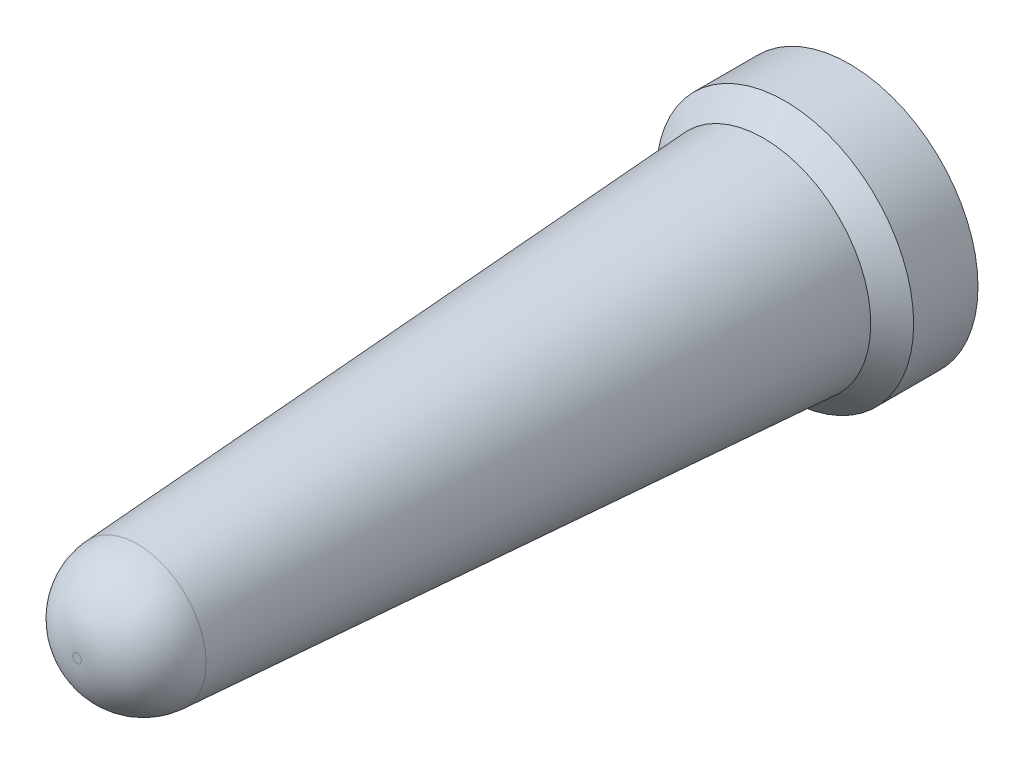
ISO-10303-21;
HEADER;
FILE_DESCRIPTION(('STEP AP214'),'2;1');
FILE_NAME('part.step','',(''),(''),'','','');
FILE_SCHEMA(('AUTOMOTIVE_DESIGN { 1 0 10303 214 1 1 1 1 }'));
ENDSEC;
DATA;
#1=APPLICATION_CONTEXT('core data for automotive mechanical design processes');
#2=APPLICATION_PROTOCOL_DEFINITION('international standard','automotive_design',2000,#1);
#3=PRODUCT_CONTEXT('',#1,'mechanical');
#4=PRODUCT('Part','Part','',(#3));
#5=PRODUCT_RELATED_PRODUCT_CATEGORY('part','',(#4));
#6=PRODUCT_DEFINITION_FORMATION('','',#4);
#7=PRODUCT_DEFINITION_CONTEXT('part definition',#1,'design');
#8=PRODUCT_DEFINITION('design','',#6,#7);
#9=PRODUCT_DEFINITION_SHAPE('','',#8);
#10=(LENGTH_UNIT() NAMED_UNIT(*) SI_UNIT(.MILLI.,.METRE.));
#11=(NAMED_UNIT(*) PLANE_ANGLE_UNIT() SI_UNIT($,.RADIAN.));
#12=(NAMED_UNIT(*) SI_UNIT($,.STERADIAN.) SOLID_ANGLE_UNIT());
#13=UNCERTAINTY_MEASURE_WITH_UNIT(LENGTH_MEASURE(1.E-05),#10,'distance_accuracy_value','');
#14=(GEOMETRIC_REPRESENTATION_CONTEXT(3) GLOBAL_UNCERTAINTY_ASSIGNED_CONTEXT((#13)) GLOBAL_UNIT_ASSIGNED_CONTEXT((#10,
#11,#12)) REPRESENTATION_CONTEXT('',''));
#15=CARTESIAN_POINT('',(0.,0.,0.));
#16=DIRECTION('',(0.,0.,1.));
#17=DIRECTION('',(1.,0.,0.));
#18=AXIS2_PLACEMENT_3D('',#15,#16,#17);
#19=CARTESIAN_POINT('',(0.,0.,2.286));
#20=DIRECTION('',(0.,0.,1.));
#21=DIRECTION('',(1.,0.,0.));
#22=AXIS2_PLACEMENT_3D('',#19,#20,#21);
#23=CYLINDRICAL_SURFACE('',#22,0.381);
#24=CARTESIAN_POINT('',(0.,0.,0.));
#25=DIRECTION('',(0.,0.,1.));
#26=DIRECTION('',(1.,0.,0.));
#27=AXIS2_PLACEMENT_3D('',#24,#25,#26);
#28=CIRCLE('',#27,0.381);
#29=CARTESIAN_POINT('',(0.381,0.,0.));
#30=VERTEX_POINT('',#29);
#31=EDGE_CURVE('E69',#30,#30,#28,.T.);
#32=ORIENTED_EDGE('',*,*,#31,.T.);
#33=EDGE_LOOP('',(#32));
#34=FACE_BOUND('',#33,.T.);
#35=CARTESIAN_POINT('',(0.,0.,0.190500000000001));
#36=DIRECTION('',(0.,0.,1.));
#37=DIRECTION('',(1.,0.,0.));
#38=AXIS2_PLACEMENT_3D('',#35,#36,#37);
#39=CIRCLE('',#38,0.381);
#40=CARTESIAN_POINT('',(0.381,0.,0.190500000000001));
#41=VERTEX_POINT('',#40);
#42=EDGE_CURVE('E11',#41,#41,#39,.T.);
#43=ORIENTED_EDGE('',*,*,#42,.F.);
#44=EDGE_LOOP('',(#43));
#45=FACE_BOUND('',#44,.T.);
#46=ADVANCED_FACE('F39',(#34,#45),#23,.T.);
#47=CARTESIAN_POINT('',(0.,0.,0.254));
#48=DIRECTION('',(0.,0.,-1.));
#49=DIRECTION('',(-1.,0.,0.));
#50=AXIS2_PLACEMENT_3D('',#47,#48,#49);
#51=CONICAL_SURFACE('',#50,0.317500000000008,0.785398163397396);
#52=ORIENTED_EDGE('',*,*,#42,.T.);
#53=EDGE_LOOP('',(#52));
#54=FACE_BOUND('',#53,.T.);
#55=CARTESIAN_POINT('',(0.,0.,0.254));
#56=DIRECTION('',(0.,0.,1.));
#57=DIRECTION('',(1.,0.,0.));
#58=AXIS2_PLACEMENT_3D('',#55,#56,#57);
#59=CIRCLE('',#58,0.317500000000008);
#60=CARTESIAN_POINT('',(0.317500000000008,0.,0.254));
#61=VERTEX_POINT('',#60);
#62=EDGE_CURVE('E46',#61,#61,#59,.T.);
#63=ORIENTED_EDGE('',*,*,#62,.F.);
#64=EDGE_LOOP('',(#63));
#65=FACE_BOUND('',#64,.T.);
#66=ADVANCED_FACE('F82',(#54,#65),#51,.T.);
#67=CARTESIAN_POINT('',(0.,0.,2.10722703261333));
#68=DIRECTION('',(0.,0.,-1.));
#69=DIRECTION('',(-1.,0.,0.));
#70=AXIS2_PLACEMENT_3D('',#67,#68,#69);
#71=CONICAL_SURFACE('',#70,0.203199999999999,0.0615981729434522);
#72=ORIENTED_EDGE('',*,*,#62,.T.);
#73=EDGE_LOOP('',(#72));
#74=FACE_BOUND('',#73,.T.);
#75=CARTESIAN_POINT('',(0.,0.,2.10722703261333));
#76=DIRECTION('',(0.,0.,1.));
#77=DIRECTION('',(1.,0.,0.));
#78=AXIS2_PLACEMENT_3D('',#75,#76,#77);
#79=CIRCLE('',#78,0.203199999999999);
#80=CARTESIAN_POINT('',(0.203199999999999,0.,2.10722703261333));
#81=VERTEX_POINT('',#80);
#82=EDGE_CURVE('E66',#81,#81,#79,.T.);
#83=ORIENTED_EDGE('',*,*,#82,.F.);
#84=EDGE_LOOP('',(#83));
#85=FACE_BOUND('',#84,.T.);
#86=ADVANCED_FACE('F79',(#74,#85),#71,.T.);
#87=CARTESIAN_POINT('',(0.,0.,2.0955));
#88=DIRECTION('',(0.,0.,1.));
#89=DIRECTION('',(1.,0.,0.));
#90=AXIS2_PLACEMENT_3D('',#87,#88,#89);
#91=DEGENERATE_TOROIDAL_SURFACE('',#90,0.013061296138619,0.190499999999999,.T.);
#92=ORIENTED_EDGE('',*,*,#82,.T.);
#93=EDGE_LOOP('',(#92));
#94=FACE_BOUND('',#93,.T.);
#95=CARTESIAN_POINT('',(0.,0.,2.286));
#96=DIRECTION('',(0.,0.,1.));
#97=DIRECTION('',(1.,0.,0.));
#98=AXIS2_PLACEMENT_3D('',#95,#96,#97);
#99=CIRCLE('',#98,0.013061296138619);
#100=CARTESIAN_POINT('',(0.013061296138619,0.,2.286));
#101=VERTEX_POINT('',#100);
#102=EDGE_CURVE('E60',#101,#101,#99,.T.);
#103=ORIENTED_EDGE('',*,*,#102,.F.);
#104=EDGE_LOOP('',(#103));
#105=FACE_BOUND('',#104,.T.);
#106=ADVANCED_FACE('F89',(#94,#105),#91,.T.);
#107=CARTESIAN_POINT('',(0.013061296138619,0.,2.286));
#108=DIRECTION('',(0.,0.,1.));
#109=DIRECTION('',(1.,0.,0.));
#110=AXIS2_PLACEMENT_3D('',#107,#108,#109);
#111=PLANE('',#110);
#112=ORIENTED_EDGE('',*,*,#102,.T.);
#113=EDGE_LOOP('',(#112));
#114=FACE_BOUND('',#113,.T.);
#115=ADVANCED_FACE('F53',(#114),#111,.T.);
#116=CARTESIAN_POINT('',(0.,0.,0.190500000000001));
#117=DIRECTION('',(0.,0.,-1.));
#118=DIRECTION('',(-1.,0.,0.));
#119=AXIS2_PLACEMENT_3D('',#116,#117,#118);
#120=CONICAL_SURFACE('',#119,0.2032,1.1042848218528);
#121=CARTESIAN_POINT('',(0.,0.,0.292828474698581));
#122=VERTEX_POINT('',#121);
#123=VERTEX_LOOP('',#122);
#124=FACE_BOUND('',#123,.T.);
#125=CARTESIAN_POINT('',(0.,0.,0.190500000000001));
#126=DIRECTION('',(0.,0.,1.));
#127=DIRECTION('',(1.,0.,0.));
#128=AXIS2_PLACEMENT_3D('',#125,#126,#127);
#129=CIRCLE('',#128,0.2032);
#130=CARTESIAN_POINT('',(0.2032,0.,0.190500000000001));
#131=VERTEX_POINT('',#130);
#132=EDGE_CURVE('E57',#131,#131,#129,.T.);
#133=ORIENTED_EDGE('',*,*,#132,.F.);
#134=EDGE_LOOP('',(#133));
#135=FACE_BOUND('',#134,.T.);
#136=ADVANCED_FACE('F49',(#124,#135),#120,.F.);
#137=CARTESIAN_POINT('',(0.,0.,2.286));
#138=DIRECTION('',(0.,0.,1.));
#139=DIRECTION('',(1.,0.,0.));
#140=AXIS2_PLACEMENT_3D('',#137,#138,#139);
#141=CYLINDRICAL_SURFACE('',#140,0.2032);
#142=ORIENTED_EDGE('',*,*,#132,.T.);
#143=EDGE_LOOP('',(#142));
#144=FACE_BOUND('',#143,.T.);
#145=CARTESIAN_POINT('',(0.,0.,0.));
#146=DIRECTION('',(0.,0.,1.));
#147=DIRECTION('',(1.,0.,0.));
#148=AXIS2_PLACEMENT_3D('',#145,#146,#147);
#149=CIRCLE('',#148,0.2032);
#150=CARTESIAN_POINT('',(0.2032,0.,0.));
#151=VERTEX_POINT('',#150);
#152=EDGE_CURVE('E61',#151,#151,#149,.T.);
#153=ORIENTED_EDGE('',*,*,#152,.F.);
#154=EDGE_LOOP('',(#153));
#155=FACE_BOUND('',#154,.T.);
#156=ADVANCED_FACE('F52',(#144,#155),#141,.F.);
#157=CARTESIAN_POINT('',(0.2032,0.,0.));
#158=DIRECTION('',(0.,0.,-1.));
#159=DIRECTION('',(-1.,0.,0.));
#160=AXIS2_PLACEMENT_3D('',#157,#158,#159);
#161=PLANE('',#160);
#162=ORIENTED_EDGE('',*,*,#152,.T.);
#163=EDGE_LOOP('',(#162));
#164=FACE_BOUND('',#163,.T.);
#165=ORIENTED_EDGE('',*,*,#31,.F.);
#166=EDGE_LOOP('',(#165));
#167=FACE_BOUND('',#166,.T.);
#168=ADVANCED_FACE('F101',(#164,#167),#161,.T.);
#169=CLOSED_SHELL('',(#46,#66,#86,#106,#115,#136,#156,#168));
#170=MANIFOLD_SOLID_BREP('B2',#169);
#171=ADVANCED_BREP_SHAPE_REPRESENTATION('',(#18,#170),#14);
#172=SHAPE_DEFINITION_REPRESENTATION(#9,#171);
ENDSEC;
END-ISO-10303-21;
